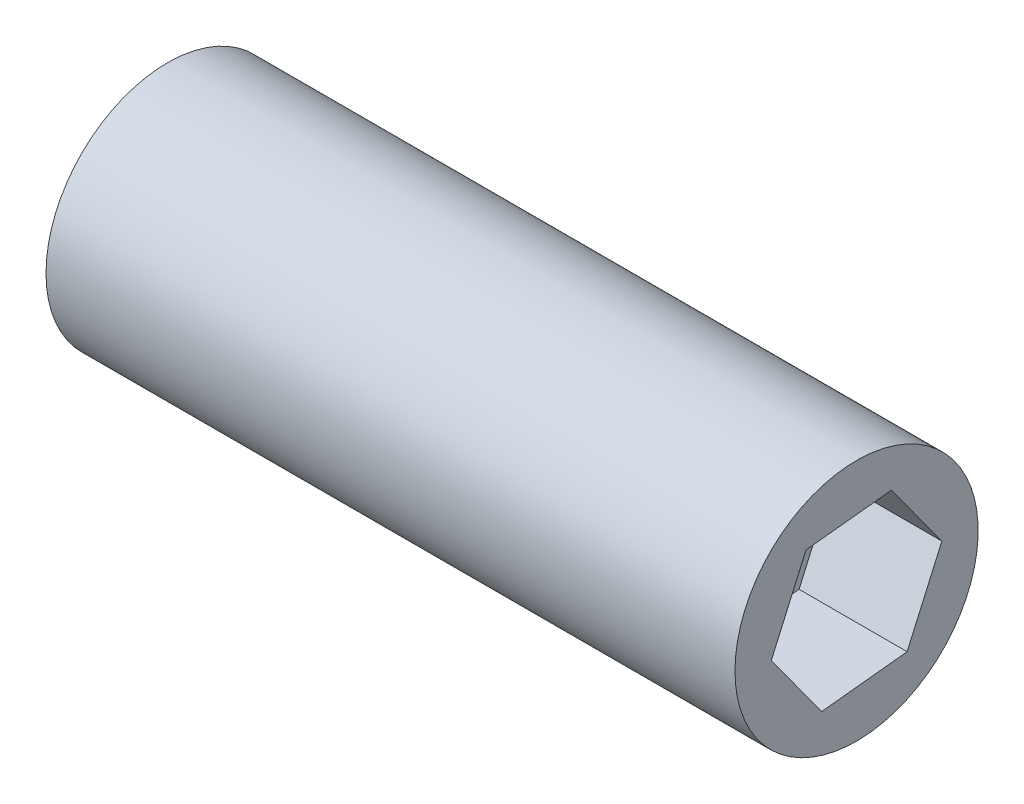
ISO-10303-21;
HEADER;
FILE_DESCRIPTION(('STEP AP214'),'2;1');
FILE_NAME('part.step','',(''),(''),'','','');
FILE_SCHEMA(('AUTOMOTIVE_DESIGN { 1 0 10303 214 1 1 1 1 }'));
ENDSEC;
DATA;
#1=APPLICATION_CONTEXT('core data for automotive mechanical design processes');
#2=APPLICATION_PROTOCOL_DEFINITION('international standard','automotive_design',2000,#1);
#3=PRODUCT_CONTEXT('',#1,'mechanical');
#4=PRODUCT('Part','Part','',(#3));
#5=PRODUCT_RELATED_PRODUCT_CATEGORY('part','',(#4));
#6=PRODUCT_DEFINITION_FORMATION('','',#4);
#7=PRODUCT_DEFINITION_CONTEXT('part definition',#1,'design');
#8=PRODUCT_DEFINITION('design','',#6,#7);
#9=PRODUCT_DEFINITION_SHAPE('','',#8);
#10=(LENGTH_UNIT() NAMED_UNIT(*) SI_UNIT(.MILLI.,.METRE.));
#11=(NAMED_UNIT(*) PLANE_ANGLE_UNIT() SI_UNIT($,.RADIAN.));
#12=(NAMED_UNIT(*) SI_UNIT($,.STERADIAN.) SOLID_ANGLE_UNIT());
#13=UNCERTAINTY_MEASURE_WITH_UNIT(LENGTH_MEASURE(1.E-05),#10,'distance_accuracy_value','');
#14=(GEOMETRIC_REPRESENTATION_CONTEXT(3) GLOBAL_UNCERTAINTY_ASSIGNED_CONTEXT((#13)) GLOBAL_UNIT_ASSIGNED_CONTEXT((#10,
#11,#12)) REPRESENTATION_CONTEXT('',''));
#15=CARTESIAN_POINT('',(0.,0.,0.));
#16=DIRECTION('',(0.,0.,1.));
#17=DIRECTION('',(1.,0.,0.));
#18=AXIS2_PLACEMENT_3D('',#15,#16,#17);
#19=CARTESIAN_POINT('',(12.7500000000012,-16.6545948642753,17.5910918956946));
#20=DIRECTION('',(-1.,0.,0.));
#21=DIRECTION('',(0.,0.,1.));
#22=AXIS2_PLACEMENT_3D('',#19,#20,#21);
#23=PLANE('',#22);
#24=CARTESIAN_POINT('',(12.7500000000012,0.,0.));
#25=DIRECTION('',(-1.,0.,0.));
#26=DIRECTION('',(0.,0.,1.));
#27=AXIS2_PLACEMENT_3D('',#24,#25,#26);
#28=CIRCLE('',#27,4.5);
#29=CARTESIAN_POINT('',(12.7500000000012,0.,4.5));
#30=VERTEX_POINT('',#29);
#31=EDGE_CURVE('E11',#30,#30,#28,.T.);
#32=ORIENTED_EDGE('',*,*,#31,.F.);
#33=EDGE_LOOP('',(#32));
#34=FACE_BOUND('',#33,.T.);
#35=DIRECTION('',(0.,0.808022681958186,0.589151377356533));
#36=VECTOR('',#35,1.);
#37=CARTESIAN_POINT('',(12.7499999999963,-2.90307459831518,1.2866589330319));
#38=LINE('',#37,#36);
#39=CARTESIAN_POINT('',(12.7500000000012,-2.90307459831518,1.2866589330319));
#40=VERTEX_POINT('',#39);
#41=CARTESIAN_POINT('',(12.7499999999963,-0.33725797714583,3.15746581773818));
#42=VERTEX_POINT('',#41);
#43=EDGE_CURVE('E52',#40,#42,#38,.T.);
#44=ORIENTED_EDGE('',*,*,#43,.T.);
#45=DIRECTION('',(0.,0.914231400444443,-0.405192480731557));
#46=VECTOR('',#45,1.);
#47=CARTESIAN_POINT('',(12.7499999999963,-0.33725797714583,3.15746581773818));
#48=LINE('',#47,#46);
#49=CARTESIAN_POINT('',(12.7499999999963,2.56581662116931,1.87080688470631));
#50=VERTEX_POINT('',#49);
#51=EDGE_CURVE('E147',#42,#50,#48,.T.);
#52=ORIENTED_EDGE('',*,*,#51,.T.);
#53=DIRECTION('',(0.,0.106208718486257,-0.99434385808809));
#54=VECTOR('',#53,1.);
#55=CARTESIAN_POINT('',(12.7499999999963,2.56581662116931,1.87080688470631));
#56=LINE('',#55,#54);
#57=CARTESIAN_POINT('',(12.7499999999963,2.9030745983151,-1.28665893303184));
#58=VERTEX_POINT('',#57);
#59=EDGE_CURVE('E150',#50,#58,#56,.T.);
#60=ORIENTED_EDGE('',*,*,#59,.T.);
#61=DIRECTION('',(0.,-0.808022681958186,-0.589151377356534));
#62=VECTOR('',#61,1.);
#63=CARTESIAN_POINT('',(12.7499999999963,2.9030745983151,-1.28665893303184));
#64=LINE('',#63,#62);
#65=CARTESIAN_POINT('',(12.7499999999963,0.337257977145754,-3.15746581773813));
#66=VERTEX_POINT('',#65);
#67=EDGE_CURVE('E168',#58,#66,#64,.T.);
#68=ORIENTED_EDGE('',*,*,#67,.T.);
#69=DIRECTION('',(0.,-0.914231400444443,0.405192480731557));
#70=VECTOR('',#69,1.);
#71=CARTESIAN_POINT('',(12.7499999999963,0.337257977145754,-3.15746581773813));
#72=LINE('',#71,#70);
#73=CARTESIAN_POINT('',(12.7499999999963,-2.56581662116939,-1.87080688470626));
#74=VERTEX_POINT('',#73);
#75=EDGE_CURVE('E165',#66,#74,#72,.T.);
#76=ORIENTED_EDGE('',*,*,#75,.T.);
#77=DIRECTION('',(0.,-0.106208718486257,0.99434385808809));
#78=VECTOR('',#77,1.);
#79=CARTESIAN_POINT('',(12.7499999999963,-2.56581662116939,-1.87080688470626));
#80=LINE('',#79,#78);
#81=EDGE_CURVE('E163',#74,#40,#80,.T.);
#82=ORIENTED_EDGE('',*,*,#81,.T.);
#83=EDGE_LOOP('',(#44,#52,#60,#68,#76,#82));
#84=FACE_BOUND('',#83,.T.);
#85=ADVANCED_FACE('F37',(#34,#84),#23,.F.);
#86=CARTESIAN_POINT('',(25.4779220613591,0.,0.));
#87=DIRECTION('',(-1.,0.,0.));
#88=DIRECTION('',(0.,0.,1.));
#89=AXIS2_PLACEMENT_3D('',#86,#87,#88);
#90=CYLINDRICAL_SURFACE('',#89,4.5);
#91=ORIENTED_EDGE('',*,*,#31,.T.);
#92=EDGE_LOOP('',(#91));
#93=FACE_BOUND('',#92,.T.);
#94=CARTESIAN_POINT('',(-12.7499999999963,0.,0.));
#95=DIRECTION('',(-1.,0.,0.));
#96=DIRECTION('',(0.,0.,1.));
#97=AXIS2_PLACEMENT_3D('',#94,#95,#96);
#98=CIRCLE('',#97,4.5);
#99=CARTESIAN_POINT('',(-12.7499999999963,0.,4.5));
#100=VERTEX_POINT('',#99);
#101=EDGE_CURVE('E45',#100,#100,#98,.F.);
#102=ORIENTED_EDGE('',*,*,#101,.T.);
#103=EDGE_LOOP('',(#102));
#104=FACE_BOUND('',#103,.T.);
#105=ADVANCED_FACE('F39',(#93,#104),#90,.T.);
#106=CARTESIAN_POINT('',(-12.7499999999963,-16.6545948642753,17.5910918956933));
#107=DIRECTION('',(-1.,0.,0.));
#108=DIRECTION('',(0.,0.,1.));
#109=AXIS2_PLACEMENT_3D('',#106,#107,#108);
#110=PLANE('',#109);
#111=DIRECTION('',(0.,0.808022681958186,0.589151377356533));
#112=VECTOR('',#111,1.);
#113=CARTESIAN_POINT('',(-12.7499999999963,-2.90307459831518,1.2866589330319));
#114=LINE('',#113,#112);
#115=CARTESIAN_POINT('',(-12.7499999999963,-2.90307459831518,1.2866589330319));
#116=VERTEX_POINT('',#115);
#117=CARTESIAN_POINT('',(-12.7499999999963,-0.33725797714583,3.15746581773818));
#118=VERTEX_POINT('',#117);
#119=EDGE_CURVE('E60',#116,#118,#114,.T.);
#120=ORIENTED_EDGE('',*,*,#119,.F.);
#121=DIRECTION('',(0.,-0.106208718486257,0.99434385808809));
#122=VECTOR('',#121,1.);
#123=CARTESIAN_POINT('',(-12.7499999999963,-2.56581662116939,-1.87080688470626));
#124=LINE('',#123,#122);
#125=CARTESIAN_POINT('',(-12.7499999999963,-2.56581662116939,-1.87080688470626));
#126=VERTEX_POINT('',#125);
#127=EDGE_CURVE('E186',#126,#116,#124,.T.);
#128=ORIENTED_EDGE('',*,*,#127,.F.);
#129=DIRECTION('',(0.,-0.914231400444443,0.405192480731557));
#130=VECTOR('',#129,1.);
#131=CARTESIAN_POINT('',(-12.7499999999963,0.337257977145754,-3.15746581773813));
#132=LINE('',#131,#130);
#133=CARTESIAN_POINT('',(-12.7499999999963,0.337257977145754,-3.15746581773813));
#134=VERTEX_POINT('',#133);
#135=EDGE_CURVE('E212',#134,#126,#132,.T.);
#136=ORIENTED_EDGE('',*,*,#135,.F.);
#137=DIRECTION('',(0.,-0.808022681958186,-0.589151377356534));
#138=VECTOR('',#137,1.);
#139=CARTESIAN_POINT('',(-12.7499999999963,2.9030745983151,-1.28665893303184));
#140=LINE('',#139,#138);
#141=CARTESIAN_POINT('',(-12.7499999999963,2.9030745983151,-1.28665893303184));
#142=VERTEX_POINT('',#141);
#143=EDGE_CURVE('E209',#142,#134,#140,.T.);
#144=ORIENTED_EDGE('',*,*,#143,.F.);
#145=DIRECTION('',(0.,0.106208718486257,-0.99434385808809));
#146=VECTOR('',#145,1.);
#147=CARTESIAN_POINT('',(-12.7499999999963,2.56581662116931,1.87080688470631));
#148=LINE('',#147,#146);
#149=CARTESIAN_POINT('',(-12.7499999999963,2.56581662116931,1.87080688470631));
#150=VERTEX_POINT('',#149);
#151=EDGE_CURVE('E206',#150,#142,#148,.T.);
#152=ORIENTED_EDGE('',*,*,#151,.F.);
#153=DIRECTION('',(0.,0.914231400444443,-0.405192480731557));
#154=VECTOR('',#153,1.);
#155=CARTESIAN_POINT('',(-12.7499999999963,-0.33725797714583,3.15746581773818));
#156=LINE('',#155,#154);
#157=EDGE_CURVE('E203',#118,#150,#156,.T.);
#158=ORIENTED_EDGE('',*,*,#157,.F.);
#159=EDGE_LOOP('',(#120,#128,#136,#144,#152,#158));
#160=FACE_BOUND('',#159,.T.);
#161=ORIENTED_EDGE('',*,*,#101,.F.);
#162=EDGE_LOOP('',(#161));
#163=FACE_BOUND('',#162,.T.);
#164=ADVANCED_FACE('F231',(#160,#163),#110,.T.);
#165=CARTESIAN_POINT('',(-8.74999999999629,-2.90307459831518,1.2866589330319));
#166=DIRECTION('',(0.,-0.589151377356533,0.808022681958186));
#167=DIRECTION('',(0.,-0.808022681958186,-0.589151377356533));
#168=AXIS2_PLACEMENT_3D('',#165,#166,#167);
#169=PLANE('',#168);
#170=ORIENTED_EDGE('',*,*,#119,.T.);
#171=DIRECTION('',(-1.,0.,0.));
#172=VECTOR('',#171,1.);
#173=CARTESIAN_POINT('',(-8.74999999999629,-0.337257977145829,3.15746581773818));
#174=LINE('',#173,#172);
#175=CARTESIAN_POINT('',(-8.74999999999629,-0.337257977145829,3.15746581773818));
#176=VERTEX_POINT('',#175);
#177=EDGE_CURVE('E201',#176,#118,#174,.T.);
#178=ORIENTED_EDGE('',*,*,#177,.F.);
#179=DIRECTION('',(0.,0.808022681958186,0.589151377356533));
#180=VECTOR('',#179,1.);
#181=CARTESIAN_POINT('',(-8.74999999999629,-2.90307459831518,1.2866589330319));
#182=LINE('',#181,#180);
#183=CARTESIAN_POINT('',(-8.74999999999629,-2.90307459831518,1.2866589330319));
#184=VERTEX_POINT('',#183);
#185=EDGE_CURVE('E182',#184,#176,#182,.T.);
#186=ORIENTED_EDGE('',*,*,#185,.F.);
#187=DIRECTION('',(-1.,0.,0.));
#188=VECTOR('',#187,1.);
#189=CARTESIAN_POINT('',(-8.74999999999629,-2.90307459831518,1.2866589330319));
#190=LINE('',#189,#188);
#191=EDGE_CURVE('E217',#184,#116,#190,.T.);
#192=ORIENTED_EDGE('',*,*,#191,.T.);
#193=EDGE_LOOP('',(#170,#178,#186,#192));
#194=FACE_BOUND('',#193,.T.);
#195=ADVANCED_FACE('F233',(#194),#169,.F.);
#196=CARTESIAN_POINT('',(-8.74999999999629,-2.56581662116939,-1.87080688470626));
#197=DIRECTION('',(0.,-0.99434385808809,-0.106208718486257));
#198=DIRECTION('',(0.,0.106208718486257,-0.99434385808809));
#199=AXIS2_PLACEMENT_3D('',#196,#197,#198);
#200=PLANE('',#199);
#201=ORIENTED_EDGE('',*,*,#127,.T.);
#202=ORIENTED_EDGE('',*,*,#191,.F.);
#203=DIRECTION('',(0.,-0.106208718486257,0.99434385808809));
#204=VECTOR('',#203,1.);
#205=CARTESIAN_POINT('',(-8.74999999999629,-2.56581662116939,-1.87080688470626));
#206=LINE('',#205,#204);
#207=CARTESIAN_POINT('',(-8.74999999999629,-2.56581662116939,-1.87080688470626));
#208=VERTEX_POINT('',#207);
#209=EDGE_CURVE('E198',#208,#184,#206,.T.);
#210=ORIENTED_EDGE('',*,*,#209,.F.);
#211=DIRECTION('',(-1.,0.,0.));
#212=VECTOR('',#211,1.);
#213=CARTESIAN_POINT('',(-8.74999999999629,-2.56581662116939,-1.87080688470626));
#214=LINE('',#213,#212);
#215=EDGE_CURVE('E219',#208,#126,#214,.T.);
#216=ORIENTED_EDGE('',*,*,#215,.T.);
#217=EDGE_LOOP('',(#201,#202,#210,#216));
#218=FACE_BOUND('',#217,.T.);
#219=ADVANCED_FACE('F240',(#218),#200,.F.);
#220=CARTESIAN_POINT('',(-8.74999999999629,0.337257977145755,-3.15746581773813));
#221=DIRECTION('',(0.,-0.405192480731557,-0.914231400444443));
#222=DIRECTION('',(0.,0.914231400444443,-0.405192480731557));
#223=AXIS2_PLACEMENT_3D('',#220,#221,#222);
#224=PLANE('',#223);
#225=ORIENTED_EDGE('',*,*,#135,.T.);
#226=ORIENTED_EDGE('',*,*,#215,.F.);
#227=DIRECTION('',(0.,-0.914231400444443,0.405192480731557));
#228=VECTOR('',#227,1.);
#229=CARTESIAN_POINT('',(-8.74999999999629,0.337257977145755,-3.15746581773813));
#230=LINE('',#229,#228);
#231=CARTESIAN_POINT('',(-8.74999999999629,0.337257977145755,-3.15746581773813));
#232=VERTEX_POINT('',#231);
#233=EDGE_CURVE('E195',#232,#208,#230,.T.);
#234=ORIENTED_EDGE('',*,*,#233,.F.);
#235=DIRECTION('',(-1.,0.,0.));
#236=VECTOR('',#235,1.);
#237=CARTESIAN_POINT('',(-8.74999999999629,0.337257977145755,-3.15746581773813));
#238=LINE('',#237,#236);
#239=EDGE_CURVE('E221',#232,#134,#238,.T.);
#240=ORIENTED_EDGE('',*,*,#239,.T.);
#241=EDGE_LOOP('',(#225,#226,#234,#240));
#242=FACE_BOUND('',#241,.T.);
#243=ADVANCED_FACE('F288',(#242),#224,.F.);
#244=CARTESIAN_POINT('',(-8.74999999999629,2.90307459831511,-1.28665893303184));
#245=DIRECTION('',(0.,0.589151377356534,-0.808022681958186));
#246=DIRECTION('',(0.,0.808022681958186,0.589151377356534));
#247=AXIS2_PLACEMENT_3D('',#244,#245,#246);
#248=PLANE('',#247);
#249=ORIENTED_EDGE('',*,*,#143,.T.);
#250=ORIENTED_EDGE('',*,*,#239,.F.);
#251=DIRECTION('',(0.,-0.808022681958186,-0.589151377356534));
#252=VECTOR('',#251,1.);
#253=CARTESIAN_POINT('',(-8.74999999999629,2.90307459831511,-1.28665893303184));
#254=LINE('',#253,#252);
#255=CARTESIAN_POINT('',(-8.74999999999629,2.90307459831511,-1.28665893303184));
#256=VERTEX_POINT('',#255);
#257=EDGE_CURVE('E192',#256,#232,#254,.T.);
#258=ORIENTED_EDGE('',*,*,#257,.F.);
#259=DIRECTION('',(-1.,0.,0.));
#260=VECTOR('',#259,1.);
#261=CARTESIAN_POINT('',(-8.74999999999629,2.90307459831511,-1.28665893303184));
#262=LINE('',#261,#260);
#263=EDGE_CURVE('E223',#256,#142,#262,.T.);
#264=ORIENTED_EDGE('',*,*,#263,.T.);
#265=EDGE_LOOP('',(#249,#250,#258,#264));
#266=FACE_BOUND('',#265,.T.);
#267=ADVANCED_FACE('F292',(#266),#248,.F.);
#268=CARTESIAN_POINT('',(-8.74999999999629,2.56581662116931,1.87080688470631));
#269=DIRECTION('',(0.,0.99434385808809,0.106208718486257));
#270=DIRECTION('',(0.,-0.106208718486257,0.99434385808809));
#271=AXIS2_PLACEMENT_3D('',#268,#269,#270);
#272=PLANE('',#271);
#273=ORIENTED_EDGE('',*,*,#151,.T.);
#274=ORIENTED_EDGE('',*,*,#263,.F.);
#275=DIRECTION('',(0.,0.106208718486257,-0.99434385808809));
#276=VECTOR('',#275,1.);
#277=CARTESIAN_POINT('',(-8.74999999999629,2.56581662116931,1.87080688470631));
#278=LINE('',#277,#276);
#279=CARTESIAN_POINT('',(-8.74999999999629,2.56581662116931,1.87080688470631));
#280=VERTEX_POINT('',#279);
#281=EDGE_CURVE('E189',#280,#256,#278,.T.);
#282=ORIENTED_EDGE('',*,*,#281,.F.);
#283=DIRECTION('',(-1.,0.,0.));
#284=VECTOR('',#283,1.);
#285=CARTESIAN_POINT('',(-8.74999999999629,2.56581662116931,1.87080688470631));
#286=LINE('',#285,#284);
#287=EDGE_CURVE('E225',#280,#150,#286,.T.);
#288=ORIENTED_EDGE('',*,*,#287,.T.);
#289=EDGE_LOOP('',(#273,#274,#282,#288));
#290=FACE_BOUND('',#289,.T.);
#291=ADVANCED_FACE('F296',(#290),#272,.F.);
#292=CARTESIAN_POINT('',(-8.74999999999629,-0.337257977145829,3.15746581773818));
#293=DIRECTION('',(0.,0.405192480731557,0.914231400444443));
#294=DIRECTION('',(0.,-0.914231400444443,0.405192480731557));
#295=AXIS2_PLACEMENT_3D('',#292,#293,#294);
#296=PLANE('',#295);
#297=ORIENTED_EDGE('',*,*,#157,.T.);
#298=ORIENTED_EDGE('',*,*,#287,.F.);
#299=DIRECTION('',(0.,0.914231400444443,-0.405192480731557));
#300=VECTOR('',#299,1.);
#301=CARTESIAN_POINT('',(-8.74999999999629,-0.337257977145829,3.15746581773818));
#302=LINE('',#301,#300);
#303=EDGE_CURVE('E185',#176,#280,#302,.T.);
#304=ORIENTED_EDGE('',*,*,#303,.F.);
#305=ORIENTED_EDGE('',*,*,#177,.T.);
#306=EDGE_LOOP('',(#297,#298,#304,#305));
#307=FACE_BOUND('',#306,.T.);
#308=ADVANCED_FACE('F284',(#307),#296,.F.);
#309=CARTESIAN_POINT('',(-8.74999999999629,0.,0.));
#310=DIRECTION('',(-1.,0.,0.));
#311=DIRECTION('',(0.,0.,1.));
#312=AXIS2_PLACEMENT_3D('',#309,#310,#311);
#313=PLANE('',#312);
#314=CARTESIAN_POINT('',(-8.74999999999629,0.,0.));
#315=DIRECTION('',(-1.,0.,0.));
#316=DIRECTION('',(0.,0.,1.));
#317=AXIS2_PLACEMENT_3D('',#314,#315,#316);
#318=CIRCLE('',#317,1.6);
#319=CARTESIAN_POINT('',(-8.7499999999963,0.,-1.6));
#320=VERTEX_POINT('',#319);
#321=EDGE_CURVE('E153',#320,#320,#318,.F.);
#322=ORIENTED_EDGE('',*,*,#321,.T.);
#323=EDGE_LOOP('',(#322));
#324=FACE_BOUND('',#323,.T.);
#325=ORIENTED_EDGE('',*,*,#185,.T.);
#326=ORIENTED_EDGE('',*,*,#303,.T.);
#327=ORIENTED_EDGE('',*,*,#281,.T.);
#328=ORIENTED_EDGE('',*,*,#257,.T.);
#329=ORIENTED_EDGE('',*,*,#233,.T.);
#330=ORIENTED_EDGE('',*,*,#209,.T.);
#331=EDGE_LOOP('',(#325,#326,#327,#328,#329,#330));
#332=FACE_BOUND('',#331,.T.);
#333=ADVANCED_FACE('F271',(#324,#332),#313,.T.);
#334=CARTESIAN_POINT('',(8.74999999999629,-2.90307459831518,1.2866589330319));
#335=DIRECTION('',(0.,0.589151377356533,-0.808022681958186));
#336=DIRECTION('',(0.,0.808022681958186,0.589151377356533));
#337=AXIS2_PLACEMENT_3D('',#334,#335,#336);
#338=PLANE('',#337);
#339=ORIENTED_EDGE('',*,*,#43,.F.);
#340=DIRECTION('',(1.,0.,0.));
#341=VECTOR('',#340,1.);
#342=CARTESIAN_POINT('',(8.74999999999629,-2.90307459831518,1.2866589330319));
#343=LINE('',#342,#341);
#344=CARTESIAN_POINT('',(8.74999999999629,-2.90307459831518,1.2866589330319));
#345=VERTEX_POINT('',#344);
#346=EDGE_CURVE('E131',#345,#40,#343,.T.);
#347=ORIENTED_EDGE('',*,*,#346,.F.);
#348=DIRECTION('',(0.,0.808022681958186,0.589151377356533));
#349=VECTOR('',#348,1.);
#350=CARTESIAN_POINT('',(8.74999999999629,-2.90307459831518,1.2866589330319));
#351=LINE('',#350,#349);
#352=CARTESIAN_POINT('',(8.74999999999629,-0.337257977145829,3.15746581773818));
#353=VERTEX_POINT('',#352);
#354=EDGE_CURVE('E138',#345,#353,#351,.T.);
#355=ORIENTED_EDGE('',*,*,#354,.T.);
#356=DIRECTION('',(1.,0.,0.));
#357=VECTOR('',#356,1.);
#358=CARTESIAN_POINT('',(8.74999999999629,-0.337257977145829,3.15746581773818));
#359=LINE('',#358,#357);
#360=EDGE_CURVE('E173',#353,#42,#359,.T.);
#361=ORIENTED_EDGE('',*,*,#360,.T.);
#362=EDGE_LOOP('',(#339,#347,#355,#361));
#363=FACE_BOUND('',#362,.T.);
#364=ADVANCED_FACE('F141',(#363),#338,.T.);
#365=CARTESIAN_POINT('',(8.74999999999629,-0.337257977145829,3.15746581773818));
#366=DIRECTION('',(0.,-0.405192480731557,-0.914231400444443));
#367=DIRECTION('',(0.,0.914231400444443,-0.405192480731557));
#368=AXIS2_PLACEMENT_3D('',#365,#366,#367);
#369=PLANE('',#368);
#370=ORIENTED_EDGE('',*,*,#51,.F.);
#371=ORIENTED_EDGE('',*,*,#360,.F.);
#372=DIRECTION('',(0.,0.914231400444443,-0.405192480731557));
#373=VECTOR('',#372,1.);
#374=CARTESIAN_POINT('',(8.74999999999629,-0.337257977145829,3.15746581773818));
#375=LINE('',#374,#373);
#376=CARTESIAN_POINT('',(8.74999999999629,2.56581662116931,1.87080688470631));
#377=VERTEX_POINT('',#376);
#378=EDGE_CURVE('E143',#353,#377,#375,.T.);
#379=ORIENTED_EDGE('',*,*,#378,.T.);
#380=DIRECTION('',(1.,0.,0.));
#381=VECTOR('',#380,1.);
#382=CARTESIAN_POINT('',(8.74999999999629,2.56581662116931,1.87080688470631));
#383=LINE('',#382,#381);
#384=EDGE_CURVE('E175',#377,#50,#383,.T.);
#385=ORIENTED_EDGE('',*,*,#384,.T.);
#386=EDGE_LOOP('',(#370,#371,#379,#385));
#387=FACE_BOUND('',#386,.T.);
#388=ADVANCED_FACE('F263',(#387),#369,.T.);
#389=CARTESIAN_POINT('',(8.74999999999629,2.56581662116931,1.87080688470631));
#390=DIRECTION('',(0.,-0.99434385808809,-0.106208718486257));
#391=DIRECTION('',(0.,0.106208718486257,-0.99434385808809));
#392=AXIS2_PLACEMENT_3D('',#389,#390,#391);
#393=PLANE('',#392);
#394=ORIENTED_EDGE('',*,*,#59,.F.);
#395=ORIENTED_EDGE('',*,*,#384,.F.);
#396=DIRECTION('',(0.,0.106208718486257,-0.99434385808809));
#397=VECTOR('',#396,1.);
#398=CARTESIAN_POINT('',(8.74999999999629,2.56581662116931,1.87080688470631));
#399=LINE('',#398,#397);
#400=CARTESIAN_POINT('',(8.74999999999629,2.90307459831511,-1.28665893303184));
#401=VERTEX_POINT('',#400);
#402=EDGE_CURVE('E159',#377,#401,#399,.T.);
#403=ORIENTED_EDGE('',*,*,#402,.T.);
#404=DIRECTION('',(1.,0.,0.));
#405=VECTOR('',#404,1.);
#406=CARTESIAN_POINT('',(8.74999999999629,2.90307459831511,-1.28665893303184));
#407=LINE('',#406,#405);
#408=EDGE_CURVE('E177',#401,#58,#407,.T.);
#409=ORIENTED_EDGE('',*,*,#408,.T.);
#410=EDGE_LOOP('',(#394,#395,#403,#409));
#411=FACE_BOUND('',#410,.T.);
#412=ADVANCED_FACE('F260',(#411),#393,.T.);
#413=CARTESIAN_POINT('',(8.74999999999629,2.90307459831511,-1.28665893303184));
#414=DIRECTION('',(0.,-0.589151377356534,0.808022681958186));
#415=DIRECTION('',(0.,-0.808022681958186,-0.589151377356534));
#416=AXIS2_PLACEMENT_3D('',#413,#414,#415);
#417=PLANE('',#416);
#418=ORIENTED_EDGE('',*,*,#67,.F.);
#419=ORIENTED_EDGE('',*,*,#408,.F.);
#420=DIRECTION('',(0.,-0.808022681958186,-0.589151377356534));
#421=VECTOR('',#420,1.);
#422=CARTESIAN_POINT('',(8.74999999999629,2.90307459831511,-1.28665893303184));
#423=LINE('',#422,#421);
#424=CARTESIAN_POINT('',(8.74999999999629,0.337257977145755,-3.15746581773813));
#425=VERTEX_POINT('',#424);
#426=EDGE_CURVE('E157',#401,#425,#423,.T.);
#427=ORIENTED_EDGE('',*,*,#426,.T.);
#428=DIRECTION('',(1.,0.,0.));
#429=VECTOR('',#428,1.);
#430=CARTESIAN_POINT('',(8.74999999999629,0.337257977145755,-3.15746581773813));
#431=LINE('',#430,#429);
#432=EDGE_CURVE('E179',#425,#66,#431,.T.);
#433=ORIENTED_EDGE('',*,*,#432,.T.);
#434=EDGE_LOOP('',(#418,#419,#427,#433));
#435=FACE_BOUND('',#434,.T.);
#436=ADVANCED_FACE('F257',(#435),#417,.T.);
#437=CARTESIAN_POINT('',(8.74999999999629,0.337257977145755,-3.15746581773813));
#438=DIRECTION('',(0.,0.405192480731557,0.914231400444443));
#439=DIRECTION('',(0.,-0.914231400444443,0.405192480731557));
#440=AXIS2_PLACEMENT_3D('',#437,#438,#439);
#441=PLANE('',#440);
#442=ORIENTED_EDGE('',*,*,#75,.F.);
#443=ORIENTED_EDGE('',*,*,#432,.F.);
#444=DIRECTION('',(0.,-0.914231400444443,0.405192480731557));
#445=VECTOR('',#444,1.);
#446=CARTESIAN_POINT('',(8.74999999999629,0.337257977145755,-3.15746581773813));
#447=LINE('',#446,#445);
#448=CARTESIAN_POINT('',(8.74999999999629,-2.56581662116939,-1.87080688470626));
#449=VERTEX_POINT('',#448);
#450=EDGE_CURVE('E137',#425,#449,#447,.T.);
#451=ORIENTED_EDGE('',*,*,#450,.T.);
#452=DIRECTION('',(1.,0.,0.));
#453=VECTOR('',#452,1.);
#454=CARTESIAN_POINT('',(8.74999999999629,-2.56581662116939,-1.87080688470626));
#455=LINE('',#454,#453);
#456=EDGE_CURVE('E133',#449,#74,#455,.T.);
#457=ORIENTED_EDGE('',*,*,#456,.T.);
#458=EDGE_LOOP('',(#442,#443,#451,#457));
#459=FACE_BOUND('',#458,.T.);
#460=ADVANCED_FACE('F253',(#459),#441,.T.);
#461=CARTESIAN_POINT('',(8.74999999999629,-2.56581662116939,-1.87080688470626));
#462=DIRECTION('',(0.,0.99434385808809,0.106208718486257));
#463=DIRECTION('',(0.,-0.106208718486257,0.99434385808809));
#464=AXIS2_PLACEMENT_3D('',#461,#462,#463);
#465=PLANE('',#464);
#466=ORIENTED_EDGE('',*,*,#81,.F.);
#467=ORIENTED_EDGE('',*,*,#456,.F.);
#468=DIRECTION('',(0.,-0.106208718486257,0.99434385808809));
#469=VECTOR('',#468,1.);
#470=CARTESIAN_POINT('',(8.74999999999629,-2.56581662116939,-1.87080688470626));
#471=LINE('',#470,#469);
#472=EDGE_CURVE('E128',#449,#345,#471,.T.);
#473=ORIENTED_EDGE('',*,*,#472,.T.);
#474=ORIENTED_EDGE('',*,*,#346,.T.);
#475=EDGE_LOOP('',(#466,#467,#473,#474));
#476=FACE_BOUND('',#475,.T.);
#477=ADVANCED_FACE('F130',(#476),#465,.T.);
#478=CARTESIAN_POINT('',(8.74999999999629,0.,0.));
#479=DIRECTION('',(1.,0.,0.));
#480=DIRECTION('',(0.,0.,1.));
#481=AXIS2_PLACEMENT_3D('',#478,#479,#480);
#482=PLANE('',#481);
#483=CARTESIAN_POINT('',(8.74999999999629,0.,0.));
#484=DIRECTION('',(1.,0.,0.));
#485=DIRECTION('',(0.,0.,-1.));
#486=AXIS2_PLACEMENT_3D('',#483,#484,#485);
#487=CIRCLE('',#486,1.6);
#488=CARTESIAN_POINT('',(8.74999999999629,0.,-1.6));
#489=VERTEX_POINT('',#488);
#490=EDGE_CURVE('E463',#489,#489,#487,.T.);
#491=ORIENTED_EDGE('',*,*,#490,.F.);
#492=EDGE_LOOP('',(#491));
#493=FACE_BOUND('',#492,.T.);
#494=ORIENTED_EDGE('',*,*,#354,.F.);
#495=ORIENTED_EDGE('',*,*,#472,.F.);
#496=ORIENTED_EDGE('',*,*,#450,.F.);
#497=ORIENTED_EDGE('',*,*,#426,.F.);
#498=ORIENTED_EDGE('',*,*,#402,.F.);
#499=ORIENTED_EDGE('',*,*,#378,.F.);
#500=EDGE_LOOP('',(#494,#495,#496,#497,#498,#499));
#501=FACE_BOUND('',#500,.T.);
#502=ADVANCED_FACE('F145',(#493,#501),#482,.T.);
#503=CARTESIAN_POINT('',(-13.2754833995902,0.,0.));
#504=DIRECTION('',(1.,0.,0.));
#505=DIRECTION('',(0.,0.,-1.));
#506=AXIS2_PLACEMENT_3D('',#503,#504,#505);
#507=CYLINDRICAL_SURFACE('',#506,1.6);
#508=CARTESIAN_POINT('',(-8.7499999999963,0.,-1.6));
#509=CARTESIAN_POINT('',(-8.56770833332971,0.,-1.6));
#510=CARTESIAN_POINT('',(-8.38541666666312,0.,-1.6));
#511=CARTESIAN_POINT('',(-8.02083333332994,0.,-1.6));
#512=CARTESIAN_POINT('',(-7.83854166666335,0.,-1.6));
#513=CARTESIAN_POINT('',(-7.47395833333017,0.,-1.6));
#514=CARTESIAN_POINT('',(-7.29166666666358,0.,-1.6));
#515=CARTESIAN_POINT('',(-6.9270833333304,0.,-1.6));
#516=CARTESIAN_POINT('',(-6.74479166666381,0.,-1.6));
#517=CARTESIAN_POINT('',(-6.38020833333063,0.,-1.6));
#518=CARTESIAN_POINT('',(-6.19791666666404,0.,-1.6));
#519=CARTESIAN_POINT('',(-5.83333333333086,0.,-1.6));
#520=CARTESIAN_POINT('',(-5.65104166666427,0.,-1.6));
#521=CARTESIAN_POINT('',(-5.28645833333109,0.,-1.6));
#522=CARTESIAN_POINT('',(-5.10416666666451,0.,-1.6));
#523=CARTESIAN_POINT('',(-4.73958333333133,0.,-1.6));
#524=CARTESIAN_POINT('',(-4.55729166666474,0.,-1.6));
#525=CARTESIAN_POINT('',(-4.19270833333156,0.,-1.6));
#526=CARTESIAN_POINT('',(-4.01041666666497,0.,-1.6));
#527=CARTESIAN_POINT('',(-3.64583333333179,0.,-1.6));
#528=CARTESIAN_POINT('',(-3.4635416666652,0.,-1.6));
#529=CARTESIAN_POINT('',(-3.09895833333202,0.,-1.6));
#530=CARTESIAN_POINT('',(-2.91666666666543,0.,-1.6));
#531=CARTESIAN_POINT('',(-2.55208333333225,0.,-1.6));
#532=CARTESIAN_POINT('',(-2.36979166666566,0.,-1.6));
#533=CARTESIAN_POINT('',(-2.00520833333248,0.,-1.6));
#534=CARTESIAN_POINT('',(-1.8229166666659,0.,-1.6));
#535=CARTESIAN_POINT('',(-1.45833333333272,0.,-1.6));
#536=CARTESIAN_POINT('',(-1.27604166666613,0.,-1.6));
#537=CARTESIAN_POINT('',(-0.911458333332947,0.,-1.6));
#538=CARTESIAN_POINT('',(-0.729166666666357,0.,-1.6));
#539=CARTESIAN_POINT('',(-0.364583333333179,0.,-1.6));
#540=CARTESIAN_POINT('',(-0.182291666666589,0.,-1.6));
#541=CARTESIAN_POINT('',(0.182291666666589,0.,-1.6));
#542=CARTESIAN_POINT('',(0.364583333333179,0.,-1.6));
#543=CARTESIAN_POINT('',(0.729166666666357,0.,-1.6));
#544=CARTESIAN_POINT('',(0.911458333332947,0.,-1.6));
#545=CARTESIAN_POINT('',(1.27604166666613,0.,-1.6));
#546=CARTESIAN_POINT('',(1.45833333333272,0.,-1.6));
#547=CARTESIAN_POINT('',(1.8229166666659,0.,-1.6));
#548=CARTESIAN_POINT('',(2.00520833333248,0.,-1.6));
#549=CARTESIAN_POINT('',(2.36979166666566,0.,-1.6));
#550=CARTESIAN_POINT('',(2.55208333333225,0.,-1.6));
#551=CARTESIAN_POINT('',(2.91666666666543,0.,-1.6));
#552=CARTESIAN_POINT('',(3.09895833333202,0.,-1.6));
#553=CARTESIAN_POINT('',(3.4635416666652,0.,-1.6));
#554=CARTESIAN_POINT('',(3.64583333333179,0.,-1.6));
#555=CARTESIAN_POINT('',(4.01041666666497,0.,-1.6));
#556=CARTESIAN_POINT('',(4.19270833333156,0.,-1.6));
#557=CARTESIAN_POINT('',(4.55729166666474,0.,-1.6));
#558=CARTESIAN_POINT('',(4.73958333333133,0.,-1.6));
#559=CARTESIAN_POINT('',(5.1041666666645,0.,-1.6));
#560=CARTESIAN_POINT('',(5.28645833333109,0.,-1.6));
#561=CARTESIAN_POINT('',(5.65104166666427,0.,-1.6));
#562=CARTESIAN_POINT('',(5.83333333333086,0.,-1.6));
#563=CARTESIAN_POINT('',(6.19791666666404,0.,-1.6));
#564=CARTESIAN_POINT('',(6.38020833333063,0.,-1.6));
#565=CARTESIAN_POINT('',(6.74479166666381,0.,-1.6));
#566=CARTESIAN_POINT('',(6.9270833333304,0.,-1.6));
#567=CARTESIAN_POINT('',(7.29166666666358,0.,-1.6));
#568=CARTESIAN_POINT('',(7.47395833333017,0.,-1.6));
#569=CARTESIAN_POINT('',(7.83854166666335,0.,-1.6));
#570=CARTESIAN_POINT('',(8.02083333332993,0.,-1.6));
#571=CARTESIAN_POINT('',(8.38541666666311,0.,-1.6));
#572=CARTESIAN_POINT('',(8.5677083333297,0.,-1.6));
#573=CARTESIAN_POINT('',(8.74999999999629,0.,-1.6));
#574=B_SPLINE_CURVE_WITH_KNOTS('',3,(#508,#509,#510,#511,#512,#513,#514,#515,#516,#517,#518,
#519,#520,#521,#522,#523,#524,#525,#526,#527,#528,#529,#530,#531,#532,#533,#534,#535,#536,#537,
#538,#539,#540,#541,#542,#543,#544,#545,#546,#547,#548,#549,#550,#551,#552,#553,#554,#555,#556,
#557,#558,#559,#560,#561,#562,#563,#564,#565,#566,#567,#568,#569,#570,#571,#572,#573),
.UNSPECIFIED.,.F.,.F.,(4,2,2,2,2,2,2,2,2,2,2,2,2,2,2,2,2,2,2,2,2,2,2,2,2,2,2,2,2,2,2,2,4),(0.,
0.54687499999977,1.09374999999954,1.64062499999931,2.18749999999907,2.73437499999884,
3.28124999999861,3.82812499999838,4.37499999999815,4.92187499999792,5.46874999999768,
6.01562499999745,6.56249999999722,7.10937499999699,7.65624999999676,8.20312499999653,
8.7499999999963,9.29687499999606,9.84374999999583,10.3906249999956,10.9374999999954,
11.4843749999951,12.0312499999949,12.5781249999947,13.1249999999944,13.6718749999942,
14.218749999994,14.7656249999937,15.3124999999935,15.8593749999933,16.4062499999931,
16.9531249999928,17.4999999999926),.UNSPECIFIED.);
#575=EDGE_CURVE('BSEAM373',#320,#489,#574,.T.);
#576=ORIENTED_EDGE('',*,*,#321,.F.);
#577=ORIENTED_EDGE('',*,*,#490,.T.);
#578=ORIENTED_EDGE('',*,*,#575,.T.);
#579=ORIENTED_EDGE('',*,*,#575,.F.);
#580=EDGE_LOOP('',(#576,#578,#577,#579));
#581=FACE_BOUND('',#580,.T.);
#582=ADVANCED_FACE('F373',(#581),#507,.F.);
#583=CLOSED_SHELL('',(#85,#105,#164,#195,#219,#243,#267,#291,#308,#333,#364,#388,#412,#436,#460,
#477,#502,#582));
#584=MANIFOLD_SOLID_BREP('B2',#583);
#585=ADVANCED_BREP_SHAPE_REPRESENTATION('',(#18,#584),#14);
#586=SHAPE_DEFINITION_REPRESENTATION(#9,#585);
ENDSEC;
END-ISO-10303-21;
